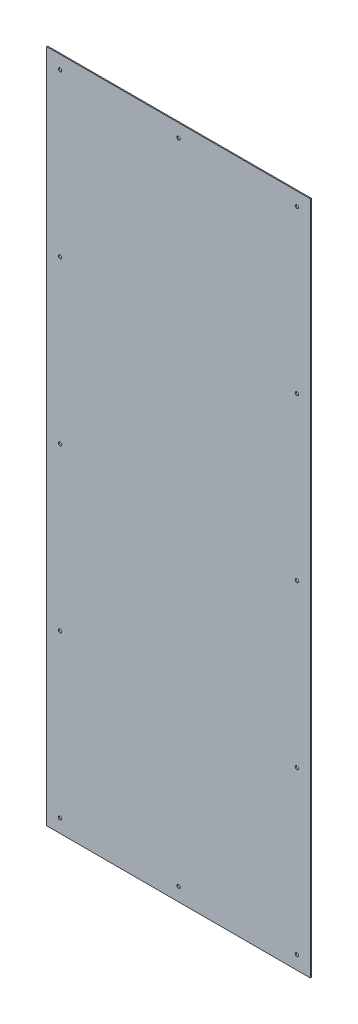
ISO-10303-21;
HEADER;
FILE_DESCRIPTION(('STEP AP214'),'2;1');
FILE_NAME('part.step','',(''),(''),'','','');
FILE_SCHEMA(('AUTOMOTIVE_DESIGN { 1 0 10303 214 1 1 1 1 }'));
ENDSEC;
DATA;
#1=APPLICATION_CONTEXT('core data for automotive mechanical design processes');
#2=APPLICATION_PROTOCOL_DEFINITION('international standard','automotive_design',2000,#1);
#3=PRODUCT_CONTEXT('',#1,'mechanical');
#4=PRODUCT('Part','Part','',(#3));
#5=PRODUCT_RELATED_PRODUCT_CATEGORY('part','',(#4));
#6=PRODUCT_DEFINITION_FORMATION('','',#4);
#7=PRODUCT_DEFINITION_CONTEXT('part definition',#1,'design');
#8=PRODUCT_DEFINITION('design','',#6,#7);
#9=PRODUCT_DEFINITION_SHAPE('','',#8);
#10=(LENGTH_UNIT() NAMED_UNIT(*) SI_UNIT(.MILLI.,.METRE.));
#11=(NAMED_UNIT(*) PLANE_ANGLE_UNIT() SI_UNIT($,.RADIAN.));
#12=(NAMED_UNIT(*) SI_UNIT($,.STERADIAN.) SOLID_ANGLE_UNIT());
#13=UNCERTAINTY_MEASURE_WITH_UNIT(LENGTH_MEASURE(1.E-05),#10,'distance_accuracy_value','');
#14=(GEOMETRIC_REPRESENTATION_CONTEXT(3) GLOBAL_UNCERTAINTY_ASSIGNED_CONTEXT((#13)) GLOBAL_UNIT_ASSIGNED_CONTEXT((#10,
#11,#12)) REPRESENTATION_CONTEXT('',''));
#15=CARTESIAN_POINT('',(0.,0.,0.));
#16=DIRECTION('',(0.,0.,1.));
#17=DIRECTION('',(1.,0.,0.));
#18=AXIS2_PLACEMENT_3D('',#15,#16,#17);
#19=CARTESIAN_POINT('',(250.,640.,1.9));
#20=DIRECTION('',(-1.,0.,0.));
#21=DIRECTION('',(0.,-1.,0.));
#22=AXIS2_PLACEMENT_3D('',#19,#20,#21);
#23=PLANE('',#22);
#24=DIRECTION('',(0.,1.,0.));
#25=VECTOR('',#24,1.);
#26=CARTESIAN_POINT('',(250.,640.,0.));
#27=LINE('',#26,#25);
#28=CARTESIAN_POINT('',(250.,-640.,0.));
#29=VERTEX_POINT('',#28);
#30=CARTESIAN_POINT('',(250.,640.,0.));
#31=VERTEX_POINT('',#30);
#32=EDGE_CURVE('E98',#29,#31,#27,.T.);
#33=ORIENTED_EDGE('',*,*,#32,.T.);
#34=DIRECTION('',(0.,0.,-1.));
#35=VECTOR('',#34,1.);
#36=CARTESIAN_POINT('',(250.,640.,1.9));
#37=LINE('',#36,#35);
#38=CARTESIAN_POINT('',(250.,640.,1.9));
#39=VERTEX_POINT('',#38);
#40=EDGE_CURVE('E11',#39,#31,#37,.T.);
#41=ORIENTED_EDGE('',*,*,#40,.F.);
#42=DIRECTION('',(0.,1.,0.));
#43=VECTOR('',#42,1.);
#44=CARTESIAN_POINT('',(250.,640.,1.9));
#45=LINE('',#44,#43);
#46=CARTESIAN_POINT('',(250.,-640.,1.9));
#47=VERTEX_POINT('',#46);
#48=EDGE_CURVE('E85',#47,#39,#45,.T.);
#49=ORIENTED_EDGE('',*,*,#48,.F.);
#50=DIRECTION('',(0.,0.,-1.));
#51=VECTOR('',#50,1.);
#52=CARTESIAN_POINT('',(250.,-640.,1.9));
#53=LINE('',#52,#51);
#54=EDGE_CURVE('E94',#47,#29,#53,.T.);
#55=ORIENTED_EDGE('',*,*,#54,.T.);
#56=EDGE_LOOP('',(#33,#41,#49,#55));
#57=FACE_BOUND('',#56,.T.);
#58=ADVANCED_FACE('F32',(#57),#23,.F.);
#59=CARTESIAN_POINT('',(-250.,640.,1.9));
#60=DIRECTION('',(0.,-1.,0.));
#61=DIRECTION('',(0.,0.,-1.));
#62=AXIS2_PLACEMENT_3D('',#59,#60,#61);
#63=PLANE('',#62);
#64=DIRECTION('',(-1.,0.,0.));
#65=VECTOR('',#64,1.);
#66=CARTESIAN_POINT('',(-250.,640.,0.));
#67=LINE('',#66,#65);
#68=CARTESIAN_POINT('',(-250.,640.,0.));
#69=VERTEX_POINT('',#68);
#70=EDGE_CURVE('E89',#31,#69,#67,.T.);
#71=ORIENTED_EDGE('',*,*,#70,.T.);
#72=DIRECTION('',(0.,0.,-1.));
#73=VECTOR('',#72,1.);
#74=CARTESIAN_POINT('',(-250.,640.,1.9));
#75=LINE('',#74,#73);
#76=CARTESIAN_POINT('',(-250.,640.,1.9));
#77=VERTEX_POINT('',#76);
#78=EDGE_CURVE('E41',#77,#69,#75,.T.);
#79=ORIENTED_EDGE('',*,*,#78,.F.);
#80=DIRECTION('',(-1.,0.,0.));
#81=VECTOR('',#80,1.);
#82=CARTESIAN_POINT('',(-250.,640.,1.9));
#83=LINE('',#82,#81);
#84=EDGE_CURVE('E80',#39,#77,#83,.T.);
#85=ORIENTED_EDGE('',*,*,#84,.F.);
#86=ORIENTED_EDGE('',*,*,#40,.T.);
#87=EDGE_LOOP('',(#71,#79,#85,#86));
#88=FACE_BOUND('',#87,.T.);
#89=ADVANCED_FACE('F88',(#88),#63,.F.);
#90=CARTESIAN_POINT('',(-250.,640.,1.9));
#91=DIRECTION('',(1.,0.,0.));
#92=DIRECTION('',(0.,1.,0.));
#93=AXIS2_PLACEMENT_3D('',#90,#91,#92);
#94=PLANE('',#93);
#95=DIRECTION('',(0.,-1.,0.));
#96=VECTOR('',#95,1.);
#97=CARTESIAN_POINT('',(-250.,640.,0.));
#98=LINE('',#97,#96);
#99=CARTESIAN_POINT('',(-250.,-640.,0.));
#100=VERTEX_POINT('',#99);
#101=EDGE_CURVE('E67',#69,#100,#98,.T.);
#102=ORIENTED_EDGE('',*,*,#101,.T.);
#103=DIRECTION('',(0.,0.,-1.));
#104=VECTOR('',#103,1.);
#105=CARTESIAN_POINT('',(-250.,-640.,1.9));
#106=LINE('',#105,#104);
#107=CARTESIAN_POINT('',(-250.,-640.,1.9));
#108=VERTEX_POINT('',#107);
#109=EDGE_CURVE('E90',#108,#100,#106,.T.);
#110=ORIENTED_EDGE('',*,*,#109,.F.);
#111=DIRECTION('',(0.,-1.,0.));
#112=VECTOR('',#111,1.);
#113=CARTESIAN_POINT('',(-250.,640.,1.9));
#114=LINE('',#113,#112);
#115=EDGE_CURVE('E83',#77,#108,#114,.T.);
#116=ORIENTED_EDGE('',*,*,#115,.F.);
#117=ORIENTED_EDGE('',*,*,#78,.T.);
#118=EDGE_LOOP('',(#102,#110,#116,#117));
#119=FACE_BOUND('',#118,.T.);
#120=ADVANCED_FACE('F92',(#119),#94,.F.);
#121=CARTESIAN_POINT('',(-250.,-640.,1.9));
#122=DIRECTION('',(0.,1.,0.));
#123=DIRECTION('',(0.,0.,1.));
#124=AXIS2_PLACEMENT_3D('',#121,#122,#123);
#125=PLANE('',#124);
#126=DIRECTION('',(1.,0.,0.));
#127=VECTOR('',#126,1.);
#128=CARTESIAN_POINT('',(-250.,-640.,0.));
#129=LINE('',#128,#127);
#130=EDGE_CURVE('E73',#100,#29,#129,.T.);
#131=ORIENTED_EDGE('',*,*,#130,.T.);
#132=ORIENTED_EDGE('',*,*,#54,.F.);
#133=DIRECTION('',(1.,0.,0.));
#134=VECTOR('',#133,1.);
#135=CARTESIAN_POINT('',(-250.,-640.,1.9));
#136=LINE('',#135,#134);
#137=EDGE_CURVE('E50',#108,#47,#136,.T.);
#138=ORIENTED_EDGE('',*,*,#137,.F.);
#139=ORIENTED_EDGE('',*,*,#109,.T.);
#140=EDGE_LOOP('',(#131,#132,#138,#139));
#141=FACE_BOUND('',#140,.T.);
#142=ADVANCED_FACE('F188',(#141),#125,.F.);
#143=CARTESIAN_POINT('',(0.,0.,1.9));
#144=DIRECTION('',(0.,0.,1.));
#145=DIRECTION('',(1.,0.,0.));
#146=AXIS2_PLACEMENT_3D('',#143,#144,#145);
#147=PLANE('',#146);
#148=CARTESIAN_POINT('',(-224.6,307.3,1.9));
#149=DIRECTION('',(0.,0.,1.));
#150=DIRECTION('',(1.,0.,0.));
#151=AXIS2_PLACEMENT_3D('',#148,#149,#150);
#152=CIRCLE('',#151,3.175);
#153=CARTESIAN_POINT('',(-221.425,307.3,1.9));
#154=VERTEX_POINT('',#153);
#155=EDGE_CURVE('E167',#154,#154,#152,.T.);
#156=ORIENTED_EDGE('',*,*,#155,.F.);
#157=EDGE_LOOP('',(#156));
#158=FACE_BOUND('',#157,.T.);
#159=CARTESIAN_POINT('',(224.6,-1.11022302462516E-13,1.9));
#160=DIRECTION('',(0.,0.,1.));
#161=DIRECTION('',(1.,0.,0.));
#162=AXIS2_PLACEMENT_3D('',#159,#160,#161);
#163=CIRCLE('',#162,3.175);
#164=CARTESIAN_POINT('',(227.775,-1.11022302462516E-13,1.9));
#165=VERTEX_POINT('',#164);
#166=EDGE_CURVE('E166',#165,#165,#163,.T.);
#167=ORIENTED_EDGE('',*,*,#166,.F.);
#168=EDGE_LOOP('',(#167));
#169=FACE_BOUND('',#168,.T.);
#170=CARTESIAN_POINT('',(-224.6,-1.11022302462516E-13,1.9));
#171=DIRECTION('',(0.,0.,1.));
#172=DIRECTION('',(1.,0.,0.));
#173=AXIS2_PLACEMENT_3D('',#170,#171,#172);
#174=CIRCLE('',#173,3.175);
#175=CARTESIAN_POINT('',(-221.425,-1.11022302462516E-13,1.9));
#176=VERTEX_POINT('',#175);
#177=EDGE_CURVE('E153',#176,#176,#174,.T.);
#178=ORIENTED_EDGE('',*,*,#177,.F.);
#179=EDGE_LOOP('',(#178));
#180=FACE_BOUND('',#179,.T.);
#181=CARTESIAN_POINT('',(224.6,307.3,1.9));
#182=DIRECTION('',(0.,0.,1.));
#183=DIRECTION('',(1.,0.,0.));
#184=AXIS2_PLACEMENT_3D('',#181,#182,#183);
#185=CIRCLE('',#184,3.175);
#186=CARTESIAN_POINT('',(227.775,307.3,1.9));
#187=VERTEX_POINT('',#186);
#188=EDGE_CURVE('E170',#187,#187,#185,.T.);
#189=ORIENTED_EDGE('',*,*,#188,.F.);
#190=EDGE_LOOP('',(#189));
#191=FACE_BOUND('',#190,.T.);
#192=CARTESIAN_POINT('',(-224.6,-307.3,1.9));
#193=DIRECTION('',(0.,0.,1.));
#194=DIRECTION('',(-1.,0.,0.));
#195=AXIS2_PLACEMENT_3D('',#192,#193,#194);
#196=CIRCLE('',#195,3.175);
#197=CARTESIAN_POINT('',(-227.775,-307.3,1.9));
#198=VERTEX_POINT('',#197);
#199=EDGE_CURVE('E176',#198,#198,#196,.T.);
#200=ORIENTED_EDGE('',*,*,#199,.F.);
#201=EDGE_LOOP('',(#200));
#202=FACE_BOUND('',#201,.T.);
#203=CARTESIAN_POINT('',(224.6,-307.3,1.9));
#204=DIRECTION('',(0.,0.,1.));
#205=DIRECTION('',(-1.,0.,0.));
#206=AXIS2_PLACEMENT_3D('',#203,#204,#205);
#207=CIRCLE('',#206,3.175);
#208=CARTESIAN_POINT('',(221.425,-307.3,1.9));
#209=VERTEX_POINT('',#208);
#210=EDGE_CURVE('E173',#209,#209,#207,.T.);
#211=ORIENTED_EDGE('',*,*,#210,.F.);
#212=EDGE_LOOP('',(#211));
#213=FACE_BOUND('',#212,.T.);
#214=CARTESIAN_POINT('',(-224.6,-614.6,1.9));
#215=DIRECTION('',(0.,0.,1.));
#216=DIRECTION('',(-1.,0.,0.));
#217=AXIS2_PLACEMENT_3D('',#214,#215,#216);
#218=CIRCLE('',#217,3.175);
#219=CARTESIAN_POINT('',(-227.775,-614.6,1.9));
#220=VERTEX_POINT('',#219);
#221=EDGE_CURVE('E149',#220,#220,#218,.T.);
#222=ORIENTED_EDGE('',*,*,#221,.F.);
#223=EDGE_LOOP('',(#222));
#224=FACE_BOUND('',#223,.T.);
#225=CARTESIAN_POINT('',(0.,-614.6,1.9));
#226=DIRECTION('',(0.,0.,1.));
#227=DIRECTION('',(-1.,0.,0.));
#228=AXIS2_PLACEMENT_3D('',#225,#226,#227);
#229=CIRCLE('',#228,3.175);
#230=CARTESIAN_POINT('',(-3.17499999999997,-614.6,1.9));
#231=VERTEX_POINT('',#230);
#232=EDGE_CURVE('E152',#231,#231,#229,.T.);
#233=ORIENTED_EDGE('',*,*,#232,.F.);
#234=EDGE_LOOP('',(#233));
#235=FACE_BOUND('',#234,.T.);
#236=CARTESIAN_POINT('',(224.6,-614.6,1.9));
#237=DIRECTION('',(0.,0.,1.));
#238=DIRECTION('',(-1.,0.,0.));
#239=AXIS2_PLACEMENT_3D('',#236,#237,#238);
#240=CIRCLE('',#239,3.175);
#241=CARTESIAN_POINT('',(221.425,-614.6,1.9));
#242=VERTEX_POINT('',#241);
#243=EDGE_CURVE('E156',#242,#242,#240,.T.);
#244=ORIENTED_EDGE('',*,*,#243,.F.);
#245=EDGE_LOOP('',(#244));
#246=FACE_BOUND('',#245,.T.);
#247=CARTESIAN_POINT('',(0.,614.6,1.9));
#248=DIRECTION('',(0.,0.,1.));
#249=DIRECTION('',(1.,0.,0.));
#250=AXIS2_PLACEMENT_3D('',#247,#248,#249);
#251=CIRCLE('',#250,3.175);
#252=CARTESIAN_POINT('',(3.17500000000003,614.6,1.9));
#253=VERTEX_POINT('',#252);
#254=EDGE_CURVE('E159',#253,#253,#251,.T.);
#255=ORIENTED_EDGE('',*,*,#254,.F.);
#256=EDGE_LOOP('',(#255));
#257=FACE_BOUND('',#256,.T.);
#258=CARTESIAN_POINT('',(224.6,614.6,1.9));
#259=DIRECTION('',(0.,0.,1.));
#260=DIRECTION('',(1.,0.,0.));
#261=AXIS2_PLACEMENT_3D('',#258,#259,#260);
#262=CIRCLE('',#261,3.175);
#263=CARTESIAN_POINT('',(227.775,614.6,1.9));
#264=VERTEX_POINT('',#263);
#265=EDGE_CURVE('E114',#264,#264,#262,.T.);
#266=ORIENTED_EDGE('',*,*,#265,.F.);
#267=EDGE_LOOP('',(#266));
#268=FACE_BOUND('',#267,.T.);
#269=CARTESIAN_POINT('',(-224.6,614.6,1.9));
#270=DIRECTION('',(0.,0.,1.));
#271=DIRECTION('',(1.,0.,0.));
#272=AXIS2_PLACEMENT_3D('',#269,#270,#271);
#273=CIRCLE('',#272,3.175);
#274=CARTESIAN_POINT('',(-221.425,614.6,1.9));
#275=VERTEX_POINT('',#274);
#276=EDGE_CURVE('E109',#275,#275,#273,.T.);
#277=ORIENTED_EDGE('',*,*,#276,.F.);
#278=EDGE_LOOP('',(#277));
#279=FACE_BOUND('',#278,.T.);
#280=ORIENTED_EDGE('',*,*,#48,.T.);
#281=ORIENTED_EDGE('',*,*,#84,.T.);
#282=ORIENTED_EDGE('',*,*,#115,.T.);
#283=ORIENTED_EDGE('',*,*,#137,.T.);
#284=EDGE_LOOP('',(#280,#281,#282,#283));
#285=FACE_BOUND('',#284,.T.);
#286=ADVANCED_FACE('F81',(#158,#169,#180,#191,#202,#213,#224,#235,#246,#257,#268,#279,#285),
#147,.T.);
#287=CARTESIAN_POINT('',(0.,0.,0.));
#288=DIRECTION('',(0.,0.,1.));
#289=DIRECTION('',(1.,0.,0.));
#290=AXIS2_PLACEMENT_3D('',#287,#288,#289);
#291=PLANE('',#290);
#292=CARTESIAN_POINT('',(-224.6,307.3,0.));
#293=DIRECTION('',(0.,0.,1.));
#294=DIRECTION('',(1.,0.,0.));
#295=AXIS2_PLACEMENT_3D('',#292,#293,#294);
#296=CIRCLE('',#295,3.175);
#297=CARTESIAN_POINT('',(-221.425,307.3,0.));
#298=VERTEX_POINT('',#297);
#299=EDGE_CURVE('E35',#298,#298,#296,.T.);
#300=ORIENTED_EDGE('',*,*,#299,.T.);
#301=EDGE_LOOP('',(#300));
#302=FACE_BOUND('',#301,.T.);
#303=CARTESIAN_POINT('',(224.6,-1.11022302462516E-13,0.));
#304=DIRECTION('',(0.,0.,1.));
#305=DIRECTION('',(1.,0.,0.));
#306=AXIS2_PLACEMENT_3D('',#303,#304,#305);
#307=CIRCLE('',#306,3.175);
#308=CARTESIAN_POINT('',(227.775,-1.11022302462516E-13,0.));
#309=VERTEX_POINT('',#308);
#310=EDGE_CURVE('E137',#309,#309,#307,.T.);
#311=ORIENTED_EDGE('',*,*,#310,.T.);
#312=EDGE_LOOP('',(#311));
#313=FACE_BOUND('',#312,.T.);
#314=CARTESIAN_POINT('',(-224.6,-1.11022302462516E-13,0.));
#315=DIRECTION('',(0.,0.,1.));
#316=DIRECTION('',(1.,0.,0.));
#317=AXIS2_PLACEMENT_3D('',#314,#315,#316);
#318=CIRCLE('',#317,3.175);
#319=CARTESIAN_POINT('',(-221.425,-1.11022302462516E-13,0.));
#320=VERTEX_POINT('',#319);
#321=EDGE_CURVE('E135',#320,#320,#318,.T.);
#322=ORIENTED_EDGE('',*,*,#321,.T.);
#323=EDGE_LOOP('',(#322));
#324=FACE_BOUND('',#323,.T.);
#325=CARTESIAN_POINT('',(224.6,307.3,0.));
#326=DIRECTION('',(0.,0.,1.));
#327=DIRECTION('',(1.,0.,0.));
#328=AXIS2_PLACEMENT_3D('',#325,#326,#327);
#329=CIRCLE('',#328,3.175);
#330=CARTESIAN_POINT('',(227.775,307.3,0.));
#331=VERTEX_POINT('',#330);
#332=EDGE_CURVE('E132',#331,#331,#329,.T.);
#333=ORIENTED_EDGE('',*,*,#332,.T.);
#334=EDGE_LOOP('',(#333));
#335=FACE_BOUND('',#334,.T.);
#336=CARTESIAN_POINT('',(-224.6,-307.3,0.));
#337=DIRECTION('',(0.,0.,1.));
#338=DIRECTION('',(1.,0.,0.));
#339=AXIS2_PLACEMENT_3D('',#336,#337,#338);
#340=CIRCLE('',#339,3.175);
#341=CARTESIAN_POINT('',(-221.425,-307.3,0.));
#342=VERTEX_POINT('',#341);
#343=EDGE_CURVE('E129',#342,#342,#340,.T.);
#344=ORIENTED_EDGE('',*,*,#343,.T.);
#345=EDGE_LOOP('',(#344));
#346=FACE_BOUND('',#345,.T.);
#347=CARTESIAN_POINT('',(224.6,-307.3,0.));
#348=DIRECTION('',(0.,0.,1.));
#349=DIRECTION('',(1.,0.,0.));
#350=AXIS2_PLACEMENT_3D('',#347,#348,#349);
#351=CIRCLE('',#350,3.175);
#352=CARTESIAN_POINT('',(227.775,-307.3,0.));
#353=VERTEX_POINT('',#352);
#354=EDGE_CURVE('E126',#353,#353,#351,.T.);
#355=ORIENTED_EDGE('',*,*,#354,.T.);
#356=EDGE_LOOP('',(#355));
#357=FACE_BOUND('',#356,.T.);
#358=CARTESIAN_POINT('',(-224.6,-614.6,0.));
#359=DIRECTION('',(0.,0.,1.));
#360=DIRECTION('',(1.,0.,0.));
#361=AXIS2_PLACEMENT_3D('',#358,#359,#360);
#362=CIRCLE('',#361,3.175);
#363=CARTESIAN_POINT('',(-221.425,-614.6,0.));
#364=VERTEX_POINT('',#363);
#365=EDGE_CURVE('E123',#364,#364,#362,.T.);
#366=ORIENTED_EDGE('',*,*,#365,.T.);
#367=EDGE_LOOP('',(#366));
#368=FACE_BOUND('',#367,.T.);
#369=CARTESIAN_POINT('',(0.,-614.6,0.));
#370=DIRECTION('',(0.,0.,1.));
#371=DIRECTION('',(1.,0.,0.));
#372=AXIS2_PLACEMENT_3D('',#369,#370,#371);
#373=CIRCLE('',#372,3.175);
#374=CARTESIAN_POINT('',(3.17500000000003,-614.6,0.));
#375=VERTEX_POINT('',#374);
#376=EDGE_CURVE('E120',#375,#375,#373,.T.);
#377=ORIENTED_EDGE('',*,*,#376,.T.);
#378=EDGE_LOOP('',(#377));
#379=FACE_BOUND('',#378,.T.);
#380=CARTESIAN_POINT('',(224.6,-614.6,0.));
#381=DIRECTION('',(0.,0.,1.));
#382=DIRECTION('',(1.,0.,0.));
#383=AXIS2_PLACEMENT_3D('',#380,#381,#382);
#384=CIRCLE('',#383,3.175);
#385=CARTESIAN_POINT('',(227.775,-614.6,0.));
#386=VERTEX_POINT('',#385);
#387=EDGE_CURVE('E117',#386,#386,#384,.T.);
#388=ORIENTED_EDGE('',*,*,#387,.T.);
#389=EDGE_LOOP('',(#388));
#390=FACE_BOUND('',#389,.T.);
#391=CARTESIAN_POINT('',(0.,614.6,0.));
#392=DIRECTION('',(0.,0.,1.));
#393=DIRECTION('',(1.,0.,0.));
#394=AXIS2_PLACEMENT_3D('',#391,#392,#393);
#395=CIRCLE('',#394,3.175);
#396=CARTESIAN_POINT('',(3.17500000000003,614.6,0.));
#397=VERTEX_POINT('',#396);
#398=EDGE_CURVE('E113',#397,#397,#395,.T.);
#399=ORIENTED_EDGE('',*,*,#398,.T.);
#400=EDGE_LOOP('',(#399));
#401=FACE_BOUND('',#400,.T.);
#402=CARTESIAN_POINT('',(224.6,614.6,0.));
#403=DIRECTION('',(0.,0.,1.));
#404=DIRECTION('',(1.,0.,0.));
#405=AXIS2_PLACEMENT_3D('',#402,#403,#404);
#406=CIRCLE('',#405,3.175);
#407=CARTESIAN_POINT('',(227.775,614.6,0.));
#408=VERTEX_POINT('',#407);
#409=EDGE_CURVE('E110',#408,#408,#406,.T.);
#410=ORIENTED_EDGE('',*,*,#409,.T.);
#411=EDGE_LOOP('',(#410));
#412=FACE_BOUND('',#411,.T.);
#413=CARTESIAN_POINT('',(-224.6,614.6,0.));
#414=DIRECTION('',(0.,0.,1.));
#415=DIRECTION('',(1.,0.,0.));
#416=AXIS2_PLACEMENT_3D('',#413,#414,#415);
#417=CIRCLE('',#416,3.175);
#418=CARTESIAN_POINT('',(-221.425,614.6,0.));
#419=VERTEX_POINT('',#418);
#420=EDGE_CURVE('E101',#419,#419,#417,.T.);
#421=ORIENTED_EDGE('',*,*,#420,.T.);
#422=EDGE_LOOP('',(#421));
#423=FACE_BOUND('',#422,.T.);
#424=ORIENTED_EDGE('',*,*,#32,.F.);
#425=ORIENTED_EDGE('',*,*,#130,.F.);
#426=ORIENTED_EDGE('',*,*,#101,.F.);
#427=ORIENTED_EDGE('',*,*,#70,.F.);
#428=EDGE_LOOP('',(#424,#425,#426,#427));
#429=FACE_BOUND('',#428,.T.);
#430=ADVANCED_FACE('F187',(#302,#313,#324,#335,#346,#357,#368,#379,#390,#401,#412,#423,#429),
#291,.F.);
#431=CARTESIAN_POINT('',(-224.6,614.6,-8.1));
#432=DIRECTION('',(0.,0.,1.));
#433=DIRECTION('',(1.,0.,0.));
#434=AXIS2_PLACEMENT_3D('',#431,#432,#433);
#435=CYLINDRICAL_SURFACE('',#434,3.175);
#436=ORIENTED_EDGE('',*,*,#276,.T.);
#437=EDGE_LOOP('',(#436));
#438=FACE_BOUND('',#437,.T.);
#439=ORIENTED_EDGE('',*,*,#420,.F.);
#440=EDGE_LOOP('',(#439));
#441=FACE_BOUND('',#440,.T.);
#442=ADVANCED_FACE('F210',(#438,#441),#435,.F.);
#443=CARTESIAN_POINT('',(224.6,614.6,-8.1));
#444=DIRECTION('',(0.,0.,1.));
#445=DIRECTION('',(1.,0.,0.));
#446=AXIS2_PLACEMENT_3D('',#443,#444,#445);
#447=CYLINDRICAL_SURFACE('',#446,3.175);
#448=ORIENTED_EDGE('',*,*,#265,.T.);
#449=EDGE_LOOP('',(#448));
#450=FACE_BOUND('',#449,.T.);
#451=ORIENTED_EDGE('',*,*,#409,.F.);
#452=EDGE_LOOP('',(#451));
#453=FACE_BOUND('',#452,.T.);
#454=ADVANCED_FACE('F206',(#450,#453),#447,.F.);
#455=CARTESIAN_POINT('',(0.,614.6,-8.1));
#456=DIRECTION('',(0.,0.,1.));
#457=DIRECTION('',(1.,0.,0.));
#458=AXIS2_PLACEMENT_3D('',#455,#456,#457);
#459=CYLINDRICAL_SURFACE('',#458,3.175);
#460=ORIENTED_EDGE('',*,*,#254,.T.);
#461=EDGE_LOOP('',(#460));
#462=FACE_BOUND('',#461,.T.);
#463=ORIENTED_EDGE('',*,*,#398,.F.);
#464=EDGE_LOOP('',(#463));
#465=FACE_BOUND('',#464,.T.);
#466=ADVANCED_FACE('F209',(#462,#465),#459,.F.);
#467=CARTESIAN_POINT('',(224.6,-614.6,-8.1));
#468=DIRECTION('',(0.,0.,1.));
#469=DIRECTION('',(1.,0.,0.));
#470=AXIS2_PLACEMENT_3D('',#467,#468,#469);
#471=CYLINDRICAL_SURFACE('',#470,3.175);
#472=ORIENTED_EDGE('',*,*,#243,.T.);
#473=EDGE_LOOP('',(#472));
#474=FACE_BOUND('',#473,.T.);
#475=ORIENTED_EDGE('',*,*,#387,.F.);
#476=EDGE_LOOP('',(#475));
#477=FACE_BOUND('',#476,.T.);
#478=ADVANCED_FACE('F276',(#474,#477),#471,.F.);
#479=CARTESIAN_POINT('',(0.,-614.6,-8.1));
#480=DIRECTION('',(0.,0.,1.));
#481=DIRECTION('',(1.,0.,0.));
#482=AXIS2_PLACEMENT_3D('',#479,#480,#481);
#483=CYLINDRICAL_SURFACE('',#482,3.175);
#484=ORIENTED_EDGE('',*,*,#232,.T.);
#485=EDGE_LOOP('',(#484));
#486=FACE_BOUND('',#485,.T.);
#487=ORIENTED_EDGE('',*,*,#376,.F.);
#488=EDGE_LOOP('',(#487));
#489=FACE_BOUND('',#488,.T.);
#490=ADVANCED_FACE('F286',(#486,#489),#483,.F.);
#491=CARTESIAN_POINT('',(-224.6,-614.6,-8.1));
#492=DIRECTION('',(0.,0.,1.));
#493=DIRECTION('',(1.,0.,0.));
#494=AXIS2_PLACEMENT_3D('',#491,#492,#493);
#495=CYLINDRICAL_SURFACE('',#494,3.175);
#496=ORIENTED_EDGE('',*,*,#221,.T.);
#497=EDGE_LOOP('',(#496));
#498=FACE_BOUND('',#497,.T.);
#499=ORIENTED_EDGE('',*,*,#365,.F.);
#500=EDGE_LOOP('',(#499));
#501=FACE_BOUND('',#500,.T.);
#502=ADVANCED_FACE('F296',(#498,#501),#495,.F.);
#503=CARTESIAN_POINT('',(224.6,-307.3,-8.1));
#504=DIRECTION('',(0.,0.,1.));
#505=DIRECTION('',(1.,0.,0.));
#506=AXIS2_PLACEMENT_3D('',#503,#504,#505);
#507=CYLINDRICAL_SURFACE('',#506,3.175);
#508=ORIENTED_EDGE('',*,*,#210,.T.);
#509=EDGE_LOOP('',(#508));
#510=FACE_BOUND('',#509,.T.);
#511=ORIENTED_EDGE('',*,*,#354,.F.);
#512=EDGE_LOOP('',(#511));
#513=FACE_BOUND('',#512,.T.);
#514=ADVANCED_FACE('F306',(#510,#513),#507,.F.);
#515=CARTESIAN_POINT('',(-224.6,-307.3,-8.1));
#516=DIRECTION('',(0.,0.,1.));
#517=DIRECTION('',(1.,0.,0.));
#518=AXIS2_PLACEMENT_3D('',#515,#516,#517);
#519=CYLINDRICAL_SURFACE('',#518,3.175);
#520=ORIENTED_EDGE('',*,*,#199,.T.);
#521=EDGE_LOOP('',(#520));
#522=FACE_BOUND('',#521,.T.);
#523=ORIENTED_EDGE('',*,*,#343,.F.);
#524=EDGE_LOOP('',(#523));
#525=FACE_BOUND('',#524,.T.);
#526=ADVANCED_FACE('F316',(#522,#525),#519,.F.);
#527=CARTESIAN_POINT('',(224.6,307.3,-8.1));
#528=DIRECTION('',(0.,0.,1.));
#529=DIRECTION('',(1.,0.,0.));
#530=AXIS2_PLACEMENT_3D('',#527,#528,#529);
#531=CYLINDRICAL_SURFACE('',#530,3.175);
#532=ORIENTED_EDGE('',*,*,#188,.T.);
#533=EDGE_LOOP('',(#532));
#534=FACE_BOUND('',#533,.T.);
#535=ORIENTED_EDGE('',*,*,#332,.F.);
#536=EDGE_LOOP('',(#535));
#537=FACE_BOUND('',#536,.T.);
#538=ADVANCED_FACE('F182',(#534,#537),#531,.F.);
#539=CARTESIAN_POINT('',(-224.6,-1.11022302462516E-13,-8.1));
#540=DIRECTION('',(0.,0.,1.));
#541=DIRECTION('',(1.,0.,0.));
#542=AXIS2_PLACEMENT_3D('',#539,#540,#541);
#543=CYLINDRICAL_SURFACE('',#542,3.175);
#544=ORIENTED_EDGE('',*,*,#177,.T.);
#545=EDGE_LOOP('',(#544));
#546=FACE_BOUND('',#545,.T.);
#547=ORIENTED_EDGE('',*,*,#321,.F.);
#548=EDGE_LOOP('',(#547));
#549=FACE_BOUND('',#548,.T.);
#550=ADVANCED_FACE('F335',(#546,#549),#543,.F.);
#551=CARTESIAN_POINT('',(224.6,-1.11022302462516E-13,-8.1));
#552=DIRECTION('',(0.,0.,1.));
#553=DIRECTION('',(1.,0.,0.));
#554=AXIS2_PLACEMENT_3D('',#551,#552,#553);
#555=CYLINDRICAL_SURFACE('',#554,3.175);
#556=ORIENTED_EDGE('',*,*,#166,.T.);
#557=EDGE_LOOP('',(#556));
#558=FACE_BOUND('',#557,.T.);
#559=ORIENTED_EDGE('',*,*,#310,.F.);
#560=EDGE_LOOP('',(#559));
#561=FACE_BOUND('',#560,.T.);
#562=ADVANCED_FACE('F344',(#558,#561),#555,.F.);
#563=CARTESIAN_POINT('',(-224.6,307.3,-8.1));
#564=DIRECTION('',(0.,0.,1.));
#565=DIRECTION('',(1.,0.,0.));
#566=AXIS2_PLACEMENT_3D('',#563,#564,#565);
#567=CYLINDRICAL_SURFACE('',#566,3.175);
#568=ORIENTED_EDGE('',*,*,#155,.T.);
#569=EDGE_LOOP('',(#568));
#570=FACE_BOUND('',#569,.T.);
#571=ORIENTED_EDGE('',*,*,#299,.F.);
#572=EDGE_LOOP('',(#571));
#573=FACE_BOUND('',#572,.T.);
#574=ADVANCED_FACE('F354',(#570,#573),#567,.F.);
#575=CLOSED_SHELL('',(#58,#89,#120,#142,#286,#430,#442,#454,#466,#478,#490,#502,#514,#526,#538,
#550,#562,#574));
#576=MANIFOLD_SOLID_BREP('B2',#575);
#577=ADVANCED_BREP_SHAPE_REPRESENTATION('',(#18,#576),#14);
#578=SHAPE_DEFINITION_REPRESENTATION(#9,#577);
ENDSEC;
END-ISO-10303-21;
